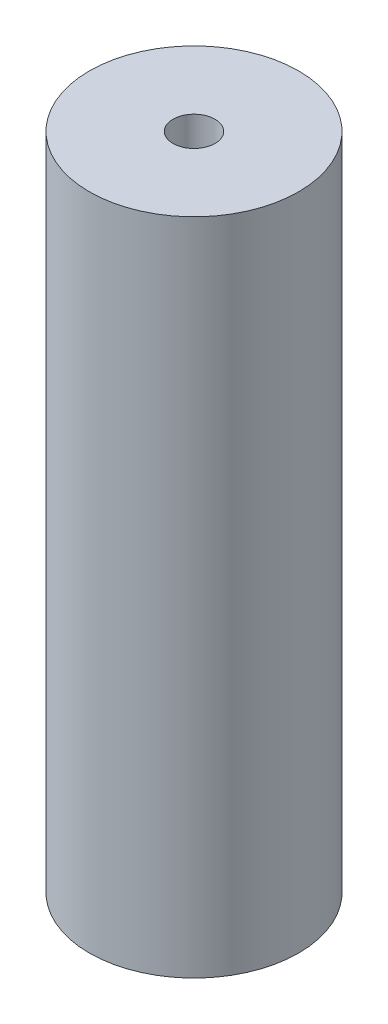
ISO-10303-21;
HEADER;
FILE_DESCRIPTION(('STEP AP214'),'2;1');
FILE_NAME('part.step','',(''),(''),'','','');
FILE_SCHEMA(('AUTOMOTIVE_DESIGN { 1 0 10303 214 1 1 1 1 }'));
ENDSEC;
DATA;
#1=APPLICATION_CONTEXT('core data for automotive mechanical design processes');
#2=APPLICATION_PROTOCOL_DEFINITION('international standard','automotive_design',2000,#1);
#3=PRODUCT_CONTEXT('',#1,'mechanical');
#4=PRODUCT('Part','Part','',(#3));
#5=PRODUCT_RELATED_PRODUCT_CATEGORY('part','',(#4));
#6=PRODUCT_DEFINITION_FORMATION('','',#4);
#7=PRODUCT_DEFINITION_CONTEXT('part definition',#1,'design');
#8=PRODUCT_DEFINITION('design','',#6,#7);
#9=PRODUCT_DEFINITION_SHAPE('','',#8);
#10=(LENGTH_UNIT() NAMED_UNIT(*) SI_UNIT(.MILLI.,.METRE.));
#11=(NAMED_UNIT(*) PLANE_ANGLE_UNIT() SI_UNIT($,.RADIAN.));
#12=(NAMED_UNIT(*) SI_UNIT($,.STERADIAN.) SOLID_ANGLE_UNIT());
#13=UNCERTAINTY_MEASURE_WITH_UNIT(LENGTH_MEASURE(1.E-05),#10,'distance_accuracy_value','');
#14=(GEOMETRIC_REPRESENTATION_CONTEXT(3) GLOBAL_UNCERTAINTY_ASSIGNED_CONTEXT((#13)) GLOBAL_UNIT_ASSIGNED_CONTEXT((#10,
#11,#12)) REPRESENTATION_CONTEXT('',''));
#15=CARTESIAN_POINT('',(0.,0.,0.));
#16=DIRECTION('',(0.,0.,1.));
#17=DIRECTION('',(1.,0.,0.));
#18=AXIS2_PLACEMENT_3D('',#15,#16,#17);
#19=CARTESIAN_POINT('',(0.,80.,0.));
#20=DIRECTION('',(0.,-1.,0.));
#21=DIRECTION('',(0.,0.,-1.));
#22=AXIS2_PLACEMENT_3D('',#19,#20,#21);
#23=CYLINDRICAL_SURFACE('',#22,12.7);
#24=CARTESIAN_POINT('',(0.,80.,0.));
#25=DIRECTION('',(0.,1.,0.));
#26=DIRECTION('',(0.,0.,1.));
#27=AXIS2_PLACEMENT_3D('',#24,#25,#26);
#28=CIRCLE('',#27,12.7);
#29=CARTESIAN_POINT('',(0.,80.,12.7));
#30=VERTEX_POINT('',#29);
#31=EDGE_CURVE('E11',#30,#30,#28,.T.);
#32=ORIENTED_EDGE('',*,*,#31,.F.);
#33=EDGE_LOOP('',(#32));
#34=FACE_BOUND('',#33,.T.);
#35=CARTESIAN_POINT('',(0.,0.,0.));
#36=DIRECTION('',(0.,1.,0.));
#37=DIRECTION('',(0.,0.,1.));
#38=AXIS2_PLACEMENT_3D('',#35,#36,#37);
#39=CIRCLE('',#38,12.7);
#40=CARTESIAN_POINT('',(0.,0.,12.7));
#41=VERTEX_POINT('',#40);
#42=EDGE_CURVE('E42',#41,#41,#39,.T.);
#43=ORIENTED_EDGE('',*,*,#42,.T.);
#44=EDGE_LOOP('',(#43));
#45=FACE_BOUND('',#44,.T.);
#46=ADVANCED_FACE('F39',(#34,#45),#23,.T.);
#47=CARTESIAN_POINT('',(0.,80.,0.));
#48=DIRECTION('',(0.,1.,0.));
#49=DIRECTION('',(0.,0.,1.));
#50=AXIS2_PLACEMENT_3D('',#47,#48,#49);
#51=PLANE('',#50);
#52=CARTESIAN_POINT('',(0.,80.,0.));
#53=DIRECTION('',(0.,1.,0.));
#54=DIRECTION('',(0.,0.,1.));
#55=AXIS2_PLACEMENT_3D('',#52,#53,#54);
#56=CIRCLE('',#55,2.55269999999999);
#57=CARTESIAN_POINT('',(0.,80.,2.55269999999999));
#58=VERTEX_POINT('',#57);
#59=EDGE_CURVE('E63',#58,#58,#56,.T.);
#60=ORIENTED_EDGE('',*,*,#59,.F.);
#61=EDGE_LOOP('',(#60));
#62=FACE_BOUND('',#61,.T.);
#63=ORIENTED_EDGE('',*,*,#31,.T.);
#64=EDGE_LOOP('',(#63));
#65=FACE_BOUND('',#64,.T.);
#66=ADVANCED_FACE('F81',(#62,#65),#51,.T.);
#67=CARTESIAN_POINT('',(0.,0.,0.));
#68=DIRECTION('',(0.,1.,0.));
#69=DIRECTION('',(0.,0.,1.));
#70=AXIS2_PLACEMENT_3D('',#67,#68,#69);
#71=PLANE('',#70);
#72=CARTESIAN_POINT('',(0.,0.,0.));
#73=DIRECTION('',(0.,-1.,0.));
#74=DIRECTION('',(0.,0.,-1.));
#75=AXIS2_PLACEMENT_3D('',#72,#73,#74);
#76=CIRCLE('',#75,2.55269999999999);
#77=CARTESIAN_POINT('',(0.,0.,-2.55269999999999));
#78=VERTEX_POINT('',#77);
#79=EDGE_CURVE('E62',#78,#78,#76,.T.);
#80=ORIENTED_EDGE('',*,*,#79,.F.);
#81=EDGE_LOOP('',(#80));
#82=FACE_BOUND('',#81,.T.);
#83=ORIENTED_EDGE('',*,*,#42,.F.);
#84=EDGE_LOOP('',(#83));
#85=FACE_BOUND('',#84,.T.);
#86=ADVANCED_FACE('F78',(#82,#85),#71,.F.);
#87=CARTESIAN_POINT('',(0.,7.62,0.));
#88=DIRECTION('',(0.,-1.,0.));
#89=DIRECTION('',(0.,0.,-1.));
#90=AXIS2_PLACEMENT_3D('',#87,#88,#89);
#91=CONICAL_SURFACE('',#90,2.5527,1.02974425867665);
#92=CARTESIAN_POINT('',(0.,9.15381690219165,0.));
#93=VERTEX_POINT('',#92);
#94=VERTEX_LOOP('',#93);
#95=FACE_BOUND('',#94,.T.);
#96=CARTESIAN_POINT('',(0.,7.62,0.));
#97=DIRECTION('',(0.,-1.,0.));
#98=DIRECTION('',(0.,0.,-1.));
#99=AXIS2_PLACEMENT_3D('',#96,#97,#98);
#100=CIRCLE('',#99,2.5527);
#101=CARTESIAN_POINT('',(0.,7.62,-2.5527));
#102=VERTEX_POINT('',#101);
#103=EDGE_CURVE('E66',#102,#102,#100,.T.);
#104=ORIENTED_EDGE('',*,*,#103,.T.);
#105=EDGE_LOOP('',(#104));
#106=FACE_BOUND('',#105,.T.);
#107=ADVANCED_FACE('F80',(#95,#106),#91,.F.);
#108=CARTESIAN_POINT('',(0.,0.,0.));
#109=DIRECTION('',(0.,-1.,0.));
#110=DIRECTION('',(0.,0.,-1.));
#111=AXIS2_PLACEMENT_3D('',#108,#109,#110);
#112=CYLINDRICAL_SURFACE('',#111,2.55269999999999);
#113=ORIENTED_EDGE('',*,*,#103,.F.);
#114=EDGE_LOOP('',(#113));
#115=FACE_BOUND('',#114,.T.);
#116=ORIENTED_EDGE('',*,*,#79,.T.);
#117=EDGE_LOOP('',(#116));
#118=FACE_BOUND('',#117,.T.);
#119=ADVANCED_FACE('F56',(#115,#118),#112,.F.);
#120=CARTESIAN_POINT('',(0.,72.38,0.));
#121=DIRECTION('',(0.,1.,0.));
#122=DIRECTION('',(0.,0.,1.));
#123=AXIS2_PLACEMENT_3D('',#120,#121,#122);
#124=CONICAL_SURFACE('',#123,2.55269999999999,1.02974425867665);
#125=CARTESIAN_POINT('',(0.,70.8461830978083,0.));
#126=VERTEX_POINT('',#125);
#127=VERTEX_LOOP('',#126);
#128=FACE_BOUND('',#127,.T.);
#129=CARTESIAN_POINT('',(0.,72.38,0.));
#130=DIRECTION('',(0.,1.,0.));
#131=DIRECTION('',(0.,0.,1.));
#132=AXIS2_PLACEMENT_3D('',#129,#130,#131);
#133=CIRCLE('',#132,2.55269999999999);
#134=CARTESIAN_POINT('',(0.,72.38,2.55269999999999));
#135=VERTEX_POINT('',#134);
#136=EDGE_CURVE('E60',#135,#135,#133,.T.);
#137=ORIENTED_EDGE('',*,*,#136,.T.);
#138=EDGE_LOOP('',(#137));
#139=FACE_BOUND('',#138,.T.);
#140=ADVANCED_FACE('F52',(#128,#139),#124,.F.);
#141=CARTESIAN_POINT('',(0.,80.,0.));
#142=DIRECTION('',(0.,1.,0.));
#143=DIRECTION('',(0.,0.,1.));
#144=AXIS2_PLACEMENT_3D('',#141,#142,#143);
#145=CYLINDRICAL_SURFACE('',#144,2.55269999999999);
#146=ORIENTED_EDGE('',*,*,#136,.F.);
#147=EDGE_LOOP('',(#146));
#148=FACE_BOUND('',#147,.T.);
#149=ORIENTED_EDGE('',*,*,#59,.T.);
#150=EDGE_LOOP('',(#149));
#151=FACE_BOUND('',#150,.T.);
#152=ADVANCED_FACE('F55',(#148,#151),#145,.F.);
#153=CLOSED_SHELL('',(#46,#66,#86,#107,#119,#140,#152));
#154=MANIFOLD_SOLID_BREP('B2',#153);
#155=ADVANCED_BREP_SHAPE_REPRESENTATION('',(#18,#154),#14);
#156=SHAPE_DEFINITION_REPRESENTATION(#9,#155);
ENDSEC;
END-ISO-10303-21;
